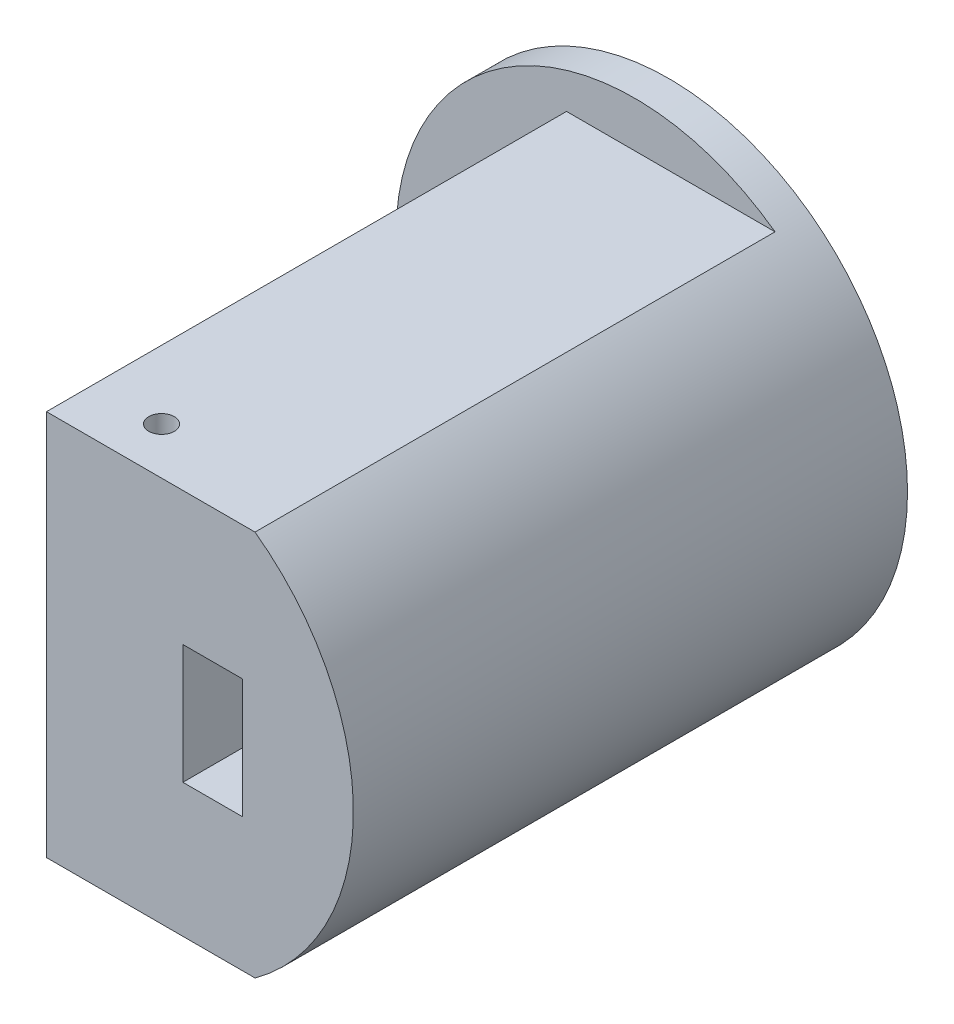
ISO-10303-21;
HEADER;
FILE_DESCRIPTION(('STEP AP214'),'2;1');
FILE_NAME('part.step','',(''),(''),'','','');
FILE_SCHEMA(('AUTOMOTIVE_DESIGN { 1 0 10303 214 1 1 1 1 }'));
ENDSEC;
DATA;
#1=APPLICATION_CONTEXT('core data for automotive mechanical design processes');
#2=APPLICATION_PROTOCOL_DEFINITION('international standard','automotive_design',2000,#1);
#3=PRODUCT_CONTEXT('',#1,'mechanical');
#4=PRODUCT('Part','Part','',(#3));
#5=PRODUCT_RELATED_PRODUCT_CATEGORY('part','',(#4));
#6=PRODUCT_DEFINITION_FORMATION('','',#4);
#7=PRODUCT_DEFINITION_CONTEXT('part definition',#1,'design');
#8=PRODUCT_DEFINITION('design','',#6,#7);
#9=PRODUCT_DEFINITION_SHAPE('','',#8);
#10=(LENGTH_UNIT() NAMED_UNIT(*) SI_UNIT(.MILLI.,.METRE.));
#11=(NAMED_UNIT(*) PLANE_ANGLE_UNIT() SI_UNIT($,.RADIAN.));
#12=(NAMED_UNIT(*) SI_UNIT($,.STERADIAN.) SOLID_ANGLE_UNIT());
#13=UNCERTAINTY_MEASURE_WITH_UNIT(LENGTH_MEASURE(1.E-05),#10,'distance_accuracy_value','');
#14=(GEOMETRIC_REPRESENTATION_CONTEXT(3) GLOBAL_UNCERTAINTY_ASSIGNED_CONTEXT((#13)) GLOBAL_UNIT_ASSIGNED_CONTEXT((#10,
#11,#12)) REPRESENTATION_CONTEXT('',''));
#15=CARTESIAN_POINT('',(0.,0.,0.));
#16=DIRECTION('',(0.,0.,1.));
#17=DIRECTION('',(1.,0.,0.));
#18=AXIS2_PLACEMENT_3D('',#15,#16,#17);
#19=CARTESIAN_POINT('',(0.,0.,32.5));
#20=DIRECTION('',(0.,0.,1.));
#21=DIRECTION('',(1.,0.,0.));
#22=AXIS2_PLACEMENT_3D('',#19,#20,#21);
#23=PLANE('',#22);
#24=DIRECTION('',(0.,-1.,0.));
#25=VECTOR('',#24,1.);
#26=CARTESIAN_POINT('',(-4.,11.3249773139559,32.5));
#27=LINE('',#26,#25);
#28=CARTESIAN_POINT('',(-4.,11.3249773139559,32.5));
#29=VERTEX_POINT('',#28);
#30=CARTESIAN_POINT('',(-4.,-11.3249773139559,32.5));
#31=VERTEX_POINT('',#30);
#32=EDGE_CURVE('E247',#29,#31,#27,.T.);
#33=ORIENTED_EDGE('',*,*,#32,.T.);
#34=DIRECTION('',(1.,0.,0.));
#35=VECTOR('',#34,1.);
#36=CARTESIAN_POINT('',(-4.,-11.3249773139559,32.5));
#37=LINE('',#36,#35);
#38=CARTESIAN_POINT('',(8.23072832976426,-11.3249773139559,32.5));
#39=VERTEX_POINT('',#38);
#40=EDGE_CURVE('E251',#31,#39,#37,.T.);
#41=ORIENTED_EDGE('',*,*,#40,.T.);
#42=CARTESIAN_POINT('',(0.,0.,32.5));
#43=DIRECTION('',(0.,0.,1.));
#44=DIRECTION('',(1.,0.,0.));
#45=AXIS2_PLACEMENT_3D('',#42,#43,#44);
#46=CIRCLE('',#45,14.);
#47=CARTESIAN_POINT('',(8.23072832976426,11.3249773139559,32.5));
#48=VERTEX_POINT('',#47);
#49=EDGE_CURVE('E195',#39,#48,#46,.T.);
#50=ORIENTED_EDGE('',*,*,#49,.T.);
#51=DIRECTION('',(-1.,0.,0.));
#52=VECTOR('',#51,1.);
#53=CARTESIAN_POINT('',(4.,11.3249773139559,32.5));
#54=LINE('',#53,#52);
#55=EDGE_CURVE('E254',#48,#29,#54,.T.);
#56=ORIENTED_EDGE('',*,*,#55,.T.);
#57=EDGE_LOOP('',(#33,#41,#50,#56));
#58=FACE_BOUND('',#57,.T.);
#59=DIRECTION('',(1.,0.,0.));
#60=VECTOR('',#59,1.);
#61=CARTESIAN_POINT('',(0.,3.5,32.5));
#62=LINE('',#61,#60);
#63=CARTESIAN_POINT('',(4.,3.5,32.5));
#64=VERTEX_POINT('',#63);
#65=CARTESIAN_POINT('',(7.5,3.5,32.5));
#66=VERTEX_POINT('',#65);
#67=EDGE_CURVE('E186',#64,#66,#62,.T.);
#68=ORIENTED_EDGE('',*,*,#67,.T.);
#69=DIRECTION('',(0.,-1.,0.));
#70=VECTOR('',#69,1.);
#71=CARTESIAN_POINT('',(7.5,0.,32.5));
#72=LINE('',#71,#70);
#73=CARTESIAN_POINT('',(7.50000000000001,-3.5,32.5));
#74=VERTEX_POINT('',#73);
#75=EDGE_CURVE('E63',#66,#74,#72,.T.);
#76=ORIENTED_EDGE('',*,*,#75,.T.);
#77=DIRECTION('',(1.,0.,0.));
#78=VECTOR('',#77,1.);
#79=CARTESIAN_POINT('',(0.,-3.5,32.5));
#80=LINE('',#79,#78);
#81=CARTESIAN_POINT('',(4.,-3.5,32.5));
#82=VERTEX_POINT('',#81);
#83=EDGE_CURVE('E173',#82,#74,#80,.T.);
#84=ORIENTED_EDGE('',*,*,#83,.F.);
#85=DIRECTION('',(0.,1.,0.));
#86=VECTOR('',#85,1.);
#87=CARTESIAN_POINT('',(4.,0.,32.5));
#88=LINE('',#87,#86);
#89=EDGE_CURVE('E177',#82,#64,#88,.T.);
#90=ORIENTED_EDGE('',*,*,#89,.T.);
#91=EDGE_LOOP('',(#68,#76,#84,#90));
#92=FACE_BOUND('',#91,.T.);
#93=ADVANCED_FACE('F47',(#58,#92),#23,.T.);
#94=CARTESIAN_POINT('',(-3.,0.,27.));
#95=DIRECTION('',(1.,0.,0.));
#96=DIRECTION('',(0.,0.,-1.));
#97=AXIS2_PLACEMENT_3D('',#94,#95,#96);
#98=PLANE('',#97);
#99=DIRECTION('',(0.,0.,-1.));
#100=VECTOR('',#99,1.);
#101=CARTESIAN_POINT('',(-3.,9.2,27.));
#102=LINE('',#101,#100);
#103=CARTESIAN_POINT('',(-3.,9.2,22.));
#104=VERTEX_POINT('',#103);
#105=CARTESIAN_POINT('',(-3.,9.2,0.));
#106=VERTEX_POINT('',#105);
#107=EDGE_CURVE('E268',#104,#106,#102,.T.);
#108=ORIENTED_EDGE('',*,*,#107,.F.);
#109=DIRECTION('',(0.,-1.,0.));
#110=VECTOR('',#109,1.);
#111=CARTESIAN_POINT('',(-3.,0.,22.));
#112=LINE('',#111,#110);
#113=CARTESIAN_POINT('',(-3.,-9.2,22.));
#114=VERTEX_POINT('',#113);
#115=EDGE_CURVE('E227',#104,#114,#112,.T.);
#116=ORIENTED_EDGE('',*,*,#115,.T.);
#117=DIRECTION('',(0.,0.,-1.));
#118=VECTOR('',#117,1.);
#119=CARTESIAN_POINT('',(-3.,-9.2,27.));
#120=LINE('',#119,#118);
#121=CARTESIAN_POINT('',(-3.,-9.2,0.));
#122=VERTEX_POINT('',#121);
#123=EDGE_CURVE('E288',#114,#122,#120,.T.);
#124=ORIENTED_EDGE('',*,*,#123,.T.);
#125=DIRECTION('',(0.,-1.,0.));
#126=VECTOR('',#125,1.);
#127=CARTESIAN_POINT('',(-3.,9.2,0.));
#128=LINE('',#127,#126);
#129=EDGE_CURVE('E243',#106,#122,#128,.T.);
#130=ORIENTED_EDGE('',*,*,#129,.F.);
#131=EDGE_LOOP('',(#108,#116,#124,#130));
#132=FACE_BOUND('',#131,.T.);
#133=ADVANCED_FACE('F325',(#132),#98,.T.);
#134=CARTESIAN_POINT('',(-4.,0.,27.));
#135=DIRECTION('',(-1.,0.,0.));
#136=DIRECTION('',(0.,-1.,0.));
#137=AXIS2_PLACEMENT_3D('',#134,#135,#136);
#138=PLANE('',#137);
#139=DIRECTION('',(0.,1.,0.));
#140=VECTOR('',#139,1.);
#141=CARTESIAN_POINT('',(-4.,0.,2.));
#142=LINE('',#141,#140);
#143=CARTESIAN_POINT('',(-4.,-11.3249773139559,2.));
#144=VERTEX_POINT('',#143);
#145=CARTESIAN_POINT('',(-4.,11.3249773139559,2.));
#146=VERTEX_POINT('',#145);
#147=EDGE_CURVE('E263',#144,#146,#142,.T.);
#148=ORIENTED_EDGE('',*,*,#147,.F.);
#149=DIRECTION('',(0.,0.,-1.));
#150=VECTOR('',#149,1.);
#151=CARTESIAN_POINT('',(-4.,-11.3249773139559,27.));
#152=LINE('',#151,#150);
#153=EDGE_CURVE('E276',#31,#144,#152,.T.);
#154=ORIENTED_EDGE('',*,*,#153,.F.);
#155=ORIENTED_EDGE('',*,*,#32,.F.);
#156=DIRECTION('',(0.,0.,-1.));
#157=VECTOR('',#156,1.);
#158=CARTESIAN_POINT('',(-4.,11.3249773139559,27.));
#159=LINE('',#158,#157);
#160=EDGE_CURVE('E280',#29,#146,#159,.T.);
#161=ORIENTED_EDGE('',*,*,#160,.T.);
#162=EDGE_LOOP('',(#148,#154,#155,#161));
#163=FACE_BOUND('',#162,.T.);
#164=DIRECTION('',(0.,1.,0.));
#165=VECTOR('',#164,1.);
#166=CARTESIAN_POINT('',(-4.,0.,22.));
#167=LINE('',#166,#165);
#168=CARTESIAN_POINT('',(-4.,-9.2,22.));
#169=VERTEX_POINT('',#168);
#170=CARTESIAN_POINT('',(-4.,9.2,22.));
#171=VERTEX_POINT('',#170);
#172=EDGE_CURVE('E56',#169,#171,#167,.T.);
#173=ORIENTED_EDGE('',*,*,#172,.T.);
#174=DIRECTION('',(0.,0.,1.));
#175=VECTOR('',#174,1.);
#176=CARTESIAN_POINT('',(-4.,9.2,27.));
#177=LINE('',#176,#175);
#178=CARTESIAN_POINT('',(-4.,9.2,27.));
#179=VERTEX_POINT('',#178);
#180=EDGE_CURVE('E11',#171,#179,#177,.T.);
#181=ORIENTED_EDGE('',*,*,#180,.T.);
#182=DIRECTION('',(0.,-1.,0.));
#183=VECTOR('',#182,1.);
#184=CARTESIAN_POINT('',(-4.,0.,27.));
#185=LINE('',#184,#183);
#186=CARTESIAN_POINT('',(-4.,-9.2,27.));
#187=VERTEX_POINT('',#186);
#188=EDGE_CURVE('E300',#179,#187,#185,.T.);
#189=ORIENTED_EDGE('',*,*,#188,.T.);
#190=DIRECTION('',(0.,0.,-1.));
#191=VECTOR('',#190,1.);
#192=CARTESIAN_POINT('',(-4.,-9.2,27.));
#193=LINE('',#192,#191);
#194=EDGE_CURVE('E307',#187,#169,#193,.T.);
#195=ORIENTED_EDGE('',*,*,#194,.T.);
#196=EDGE_LOOP('',(#173,#181,#189,#195));
#197=FACE_BOUND('',#196,.T.);
#198=ADVANCED_FACE('F313',(#163,#197),#138,.T.);
#199=CARTESIAN_POINT('',(0.,-9.2,27.));
#200=DIRECTION('',(0.,1.,0.));
#201=DIRECTION('',(0.,0.,1.));
#202=AXIS2_PLACEMENT_3D('',#199,#200,#201);
#203=PLANE('',#202);
#204=DIRECTION('',(0.,0.,-1.));
#205=VECTOR('',#204,1.);
#206=CARTESIAN_POINT('',(3.,-9.2,27.));
#207=LINE('',#206,#205);
#208=CARTESIAN_POINT('',(3.,-9.2,27.));
#209=VERTEX_POINT('',#208);
#210=CARTESIAN_POINT('',(3.,-9.2,0.));
#211=VERTEX_POINT('',#210);
#212=EDGE_CURVE('E291',#209,#211,#207,.T.);
#213=ORIENTED_EDGE('',*,*,#212,.T.);
#214=DIRECTION('',(1.,0.,0.));
#215=VECTOR('',#214,1.);
#216=CARTESIAN_POINT('',(-3.,-9.2,0.));
#217=LINE('',#216,#215);
#218=EDGE_CURVE('E231',#122,#211,#217,.T.);
#219=ORIENTED_EDGE('',*,*,#218,.F.);
#220=ORIENTED_EDGE('',*,*,#123,.F.);
#221=DIRECTION('',(1.,0.,0.));
#222=VECTOR('',#221,1.);
#223=CARTESIAN_POINT('',(-14.,-9.2,22.));
#224=LINE('',#223,#222);
#225=EDGE_CURVE('E220',#169,#114,#224,.T.);
#226=ORIENTED_EDGE('',*,*,#225,.F.);
#227=ORIENTED_EDGE('',*,*,#194,.F.);
#228=DIRECTION('',(1.,0.,0.));
#229=VECTOR('',#228,1.);
#230=CARTESIAN_POINT('',(0.,-9.2,27.));
#231=LINE('',#230,#229);
#232=EDGE_CURVE('E71',#187,#209,#231,.T.);
#233=ORIENTED_EDGE('',*,*,#232,.T.);
#234=EDGE_LOOP('',(#213,#219,#220,#226,#227,#233));
#235=FACE_BOUND('',#234,.T.);
#236=ADVANCED_FACE('F320',(#235),#203,.T.);
#237=CARTESIAN_POINT('',(3.,0.,27.));
#238=DIRECTION('',(1.,0.,0.));
#239=DIRECTION('',(0.,0.,-1.));
#240=AXIS2_PLACEMENT_3D('',#237,#238,#239);
#241=PLANE('',#240);
#242=DIRECTION('',(0.,0.,-1.));
#243=VECTOR('',#242,1.);
#244=CARTESIAN_POINT('',(3.,9.2,27.));
#245=LINE('',#244,#243);
#246=CARTESIAN_POINT('',(3.,9.2,27.));
#247=VERTEX_POINT('',#246);
#248=CARTESIAN_POINT('',(3.,9.2,0.));
#249=VERTEX_POINT('',#248);
#250=EDGE_CURVE('E281',#247,#249,#245,.T.);
#251=ORIENTED_EDGE('',*,*,#250,.T.);
#252=DIRECTION('',(0.,1.,0.));
#253=VECTOR('',#252,1.);
#254=CARTESIAN_POINT('',(3.,-9.2,0.));
#255=LINE('',#254,#253);
#256=EDGE_CURVE('E235',#211,#249,#255,.T.);
#257=ORIENTED_EDGE('',*,*,#256,.F.);
#258=ORIENTED_EDGE('',*,*,#212,.F.);
#259=DIRECTION('',(0.,-1.,0.));
#260=VECTOR('',#259,1.);
#261=CARTESIAN_POINT('',(3.,0.,27.));
#262=LINE('',#261,#260);
#263=EDGE_CURVE('E262',#247,#209,#262,.T.);
#264=ORIENTED_EDGE('',*,*,#263,.F.);
#265=EDGE_LOOP('',(#251,#257,#258,#264));
#266=FACE_BOUND('',#265,.T.);
#267=ADVANCED_FACE('F342',(#266),#241,.F.);
#268=CARTESIAN_POINT('',(0.,9.2,27.));
#269=DIRECTION('',(0.,1.,0.));
#270=DIRECTION('',(0.,0.,1.));
#271=AXIS2_PLACEMENT_3D('',#268,#269,#270);
#272=PLANE('',#271);
#273=DIRECTION('',(1.,0.,0.));
#274=VECTOR('',#273,1.);
#275=CARTESIAN_POINT('',(0.,9.2,27.));
#276=LINE('',#275,#274);
#277=EDGE_CURVE('E259',#179,#247,#276,.T.);
#278=ORIENTED_EDGE('',*,*,#277,.F.);
#279=ORIENTED_EDGE('',*,*,#180,.F.);
#280=DIRECTION('',(1.,0.,0.));
#281=VECTOR('',#280,1.);
#282=CARTESIAN_POINT('',(-14.,9.2,22.));
#283=LINE('',#282,#281);
#284=EDGE_CURVE('E223',#171,#104,#283,.T.);
#285=ORIENTED_EDGE('',*,*,#284,.T.);
#286=ORIENTED_EDGE('',*,*,#107,.T.);
#287=DIRECTION('',(-1.,0.,0.));
#288=VECTOR('',#287,1.);
#289=CARTESIAN_POINT('',(3.,9.2,0.));
#290=LINE('',#289,#288);
#291=EDGE_CURVE('E239',#249,#106,#290,.T.);
#292=ORIENTED_EDGE('',*,*,#291,.F.);
#293=ORIENTED_EDGE('',*,*,#250,.F.);
#294=EDGE_LOOP('',(#278,#279,#285,#286,#292,#293));
#295=FACE_BOUND('',#294,.T.);
#296=ADVANCED_FACE('F327',(#295),#272,.F.);
#297=CARTESIAN_POINT('',(0.,0.,27.));
#298=DIRECTION('',(0.,0.,1.));
#299=DIRECTION('',(1.,0.,0.));
#300=AXIS2_PLACEMENT_3D('',#297,#298,#299);
#301=PLANE('',#300);
#302=ORIENTED_EDGE('',*,*,#232,.F.);
#303=ORIENTED_EDGE('',*,*,#188,.F.);
#304=ORIENTED_EDGE('',*,*,#277,.T.);
#305=ORIENTED_EDGE('',*,*,#263,.T.);
#306=EDGE_LOOP('',(#302,#303,#304,#305));
#307=FACE_BOUND('',#306,.T.);
#308=ADVANCED_FACE('F331',(#307),#301,.F.);
#309=CARTESIAN_POINT('',(0.,0.,2.));
#310=DIRECTION('',(0.,0.,1.));
#311=DIRECTION('',(1.,0.,0.));
#312=AXIS2_PLACEMENT_3D('',#309,#310,#311);
#313=PLANE('',#312);
#314=DIRECTION('',(1.,0.,0.));
#315=VECTOR('',#314,1.);
#316=CARTESIAN_POINT('',(0.,11.3249773139559,2.));
#317=LINE('',#316,#315);
#318=CARTESIAN_POINT('',(8.23072832976426,11.3249773139559,2.));
#319=VERTEX_POINT('',#318);
#320=EDGE_CURVE('E271',#146,#319,#317,.T.);
#321=ORIENTED_EDGE('',*,*,#320,.T.);
#322=CARTESIAN_POINT('',(0.,0.,2.));
#323=DIRECTION('',(0.,0.,1.));
#324=DIRECTION('',(1.,0.,0.));
#325=AXIS2_PLACEMENT_3D('',#322,#323,#324);
#326=CIRCLE('',#325,14.);
#327=CARTESIAN_POINT('',(8.23072832976426,-11.3249773139559,2.));
#328=VERTEX_POINT('',#327);
#329=EDGE_CURVE('E296',#319,#328,#326,.T.);
#330=ORIENTED_EDGE('',*,*,#329,.T.);
#331=DIRECTION('',(1.,0.,0.));
#332=VECTOR('',#331,1.);
#333=CARTESIAN_POINT('',(0.,-11.3249773139559,2.));
#334=LINE('',#333,#332);
#335=EDGE_CURVE('E258',#144,#328,#334,.T.);
#336=ORIENTED_EDGE('',*,*,#335,.F.);
#337=ORIENTED_EDGE('',*,*,#147,.T.);
#338=EDGE_LOOP('',(#321,#330,#336,#337));
#339=FACE_BOUND('',#338,.T.);
#340=ADVANCED_FACE('F333',(#339),#313,.T.);
#341=CARTESIAN_POINT('',(0.,0.,2.));
#342=DIRECTION('',(0.,0.,-1.));
#343=DIRECTION('',(-1.,0.,0.));
#344=AXIS2_PLACEMENT_3D('',#341,#342,#343);
#345=CYLINDRICAL_SURFACE('',#344,14.);
#346=ORIENTED_EDGE('',*,*,#329,.F.);
#347=DIRECTION('',(0.,0.,-1.));
#348=VECTOR('',#347,1.);
#349=CARTESIAN_POINT('',(8.23072832976426,11.3249773139559,57.259249678584));
#350=LINE('',#349,#348);
#351=EDGE_CURVE('E204',#48,#319,#350,.T.);
#352=ORIENTED_EDGE('',*,*,#351,.F.);
#353=ORIENTED_EDGE('',*,*,#49,.F.);
#354=DIRECTION('',(0.,0.,-1.));
#355=VECTOR('',#354,1.);
#356=CARTESIAN_POINT('',(8.23072832976426,-11.3249773139559,57.259249678584));
#357=LINE('',#356,#355);
#358=EDGE_CURVE('E205',#39,#328,#357,.T.);
#359=ORIENTED_EDGE('',*,*,#358,.T.);
#360=EDGE_LOOP('',(#346,#352,#353,#359));
#361=FACE_BOUND('',#360,.T.);
#362=CARTESIAN_POINT('',(0.,0.,0.));
#363=DIRECTION('',(0.,0.,1.));
#364=DIRECTION('',(1.,0.,0.));
#365=AXIS2_PLACEMENT_3D('',#362,#363,#364);
#366=CIRCLE('',#365,14.);
#367=CARTESIAN_POINT('',(14.,0.,0.));
#368=VERTEX_POINT('',#367);
#369=EDGE_CURVE('E285',#368,#368,#366,.T.);
#370=ORIENTED_EDGE('',*,*,#369,.T.);
#371=EDGE_LOOP('',(#370));
#372=FACE_BOUND('',#371,.T.);
#373=ADVANCED_FACE('F49',(#361,#372),#345,.T.);
#374=CARTESIAN_POINT('',(0.,0.,0.));
#375=DIRECTION('',(0.,0.,1.));
#376=DIRECTION('',(1.,0.,0.));
#377=AXIS2_PLACEMENT_3D('',#374,#375,#376);
#378=PLANE('',#377);
#379=ORIENTED_EDGE('',*,*,#129,.T.);
#380=ORIENTED_EDGE('',*,*,#218,.T.);
#381=ORIENTED_EDGE('',*,*,#256,.T.);
#382=ORIENTED_EDGE('',*,*,#291,.T.);
#383=EDGE_LOOP('',(#379,#380,#381,#382));
#384=FACE_BOUND('',#383,.T.);
#385=ORIENTED_EDGE('',*,*,#369,.F.);
#386=EDGE_LOOP('',(#385));
#387=FACE_BOUND('',#386,.T.);
#388=ADVANCED_FACE('F406',(#384,#387),#378,.F.);
#389=CARTESIAN_POINT('',(0.,-11.3249773139559,27.));
#390=DIRECTION('',(0.,1.,0.));
#391=DIRECTION('',(-1.,0.,0.));
#392=AXIS2_PLACEMENT_3D('',#389,#390,#391);
#393=PLANE('',#392);
#394=CARTESIAN_POINT('',(0.,-11.3249773139559,29.75));
#395=DIRECTION('',(0.,1.,0.));
#396=DIRECTION('',(-1.,0.,0.));
#397=AXIS2_PLACEMENT_3D('',#394,#395,#396);
#398=CIRCLE('',#397,0.75);
#399=CARTESIAN_POINT('',(-0.749999999999998,-11.3249773139559,29.75));
#400=VERTEX_POINT('',#399);
#401=EDGE_CURVE('E216',#400,#400,#398,.T.);
#402=ORIENTED_EDGE('',*,*,#401,.T.);
#403=EDGE_LOOP('',(#402));
#404=FACE_BOUND('',#403,.T.);
#405=ORIENTED_EDGE('',*,*,#335,.T.);
#406=ORIENTED_EDGE('',*,*,#358,.F.);
#407=ORIENTED_EDGE('',*,*,#40,.F.);
#408=ORIENTED_EDGE('',*,*,#153,.T.);
#409=EDGE_LOOP('',(#405,#406,#407,#408));
#410=FACE_BOUND('',#409,.T.);
#411=ADVANCED_FACE('F399',(#404,#410),#393,.F.);
#412=CARTESIAN_POINT('',(0.,11.3249773139559,27.));
#413=DIRECTION('',(0.,1.,0.));
#414=DIRECTION('',(-1.,0.,0.));
#415=AXIS2_PLACEMENT_3D('',#412,#413,#414);
#416=PLANE('',#415);
#417=CARTESIAN_POINT('',(0.,11.3249773139559,29.75));
#418=DIRECTION('',(0.,1.,0.));
#419=DIRECTION('',(-1.,0.,0.));
#420=AXIS2_PLACEMENT_3D('',#417,#418,#419);
#421=CIRCLE('',#420,0.75);
#422=CARTESIAN_POINT('',(-0.750000000000003,11.3249773139559,29.75));
#423=VERTEX_POINT('',#422);
#424=EDGE_CURVE('E209',#423,#423,#421,.T.);
#425=ORIENTED_EDGE('',*,*,#424,.F.);
#426=EDGE_LOOP('',(#425));
#427=FACE_BOUND('',#426,.T.);
#428=ORIENTED_EDGE('',*,*,#320,.F.);
#429=ORIENTED_EDGE('',*,*,#160,.F.);
#430=ORIENTED_EDGE('',*,*,#55,.F.);
#431=ORIENTED_EDGE('',*,*,#351,.T.);
#432=EDGE_LOOP('',(#428,#429,#430,#431));
#433=FACE_BOUND('',#432,.T.);
#434=ADVANCED_FACE('F359',(#427,#433),#416,.T.);
#435=CARTESIAN_POINT('',(-14.,0.,22.));
#436=DIRECTION('',(0.,0.,1.));
#437=DIRECTION('',(0.,-1.,0.));
#438=AXIS2_PLACEMENT_3D('',#435,#436,#437);
#439=PLANE('',#438);
#440=ORIENTED_EDGE('',*,*,#284,.F.);
#441=ORIENTED_EDGE('',*,*,#172,.F.);
#442=ORIENTED_EDGE('',*,*,#225,.T.);
#443=ORIENTED_EDGE('',*,*,#115,.F.);
#444=EDGE_LOOP('',(#440,#441,#442,#443));
#445=FACE_BOUND('',#444,.T.);
#446=ADVANCED_FACE('F317',(#445),#439,.T.);
#447=CARTESIAN_POINT('',(0.,-14.,29.75));
#448=DIRECTION('',(0.,1.,0.));
#449=DIRECTION('',(-1.,0.,0.));
#450=AXIS2_PLACEMENT_3D('',#447,#448,#449);
#451=CYLINDRICAL_SURFACE('',#450,0.75);
#452=ORIENTED_EDGE('',*,*,#424,.T.);
#453=EDGE_LOOP('',(#452));
#454=FACE_BOUND('',#453,.T.);
#455=ORIENTED_EDGE('',*,*,#401,.F.);
#456=EDGE_LOOP('',(#455));
#457=FACE_BOUND('',#456,.T.);
#458=ADVANCED_FACE('F358',(#454,#457),#451,.F.);
#459=CARTESIAN_POINT('',(7.5,0.,26.5));
#460=DIRECTION('',(-1.,0.,0.));
#461=DIRECTION('',(0.,-1.,0.));
#462=AXIS2_PLACEMENT_3D('',#459,#460,#461);
#463=PLANE('',#462);
#464=ORIENTED_EDGE('',*,*,#75,.F.);
#465=DIRECTION('',(0.,0.,1.));
#466=VECTOR('',#465,1.);
#467=CARTESIAN_POINT('',(7.5,3.5,26.5));
#468=LINE('',#467,#466);
#469=CARTESIAN_POINT('',(7.5,3.5,26.5));
#470=VERTEX_POINT('',#469);
#471=EDGE_CURVE('E154',#470,#66,#468,.T.);
#472=ORIENTED_EDGE('',*,*,#471,.F.);
#473=DIRECTION('',(0.,-1.,0.));
#474=VECTOR('',#473,1.);
#475=CARTESIAN_POINT('',(7.5,0.,26.5));
#476=LINE('',#475,#474);
#477=CARTESIAN_POINT('',(7.50000000000001,-3.5,26.5));
#478=VERTEX_POINT('',#477);
#479=EDGE_CURVE('E162',#470,#478,#476,.T.);
#480=ORIENTED_EDGE('',*,*,#479,.T.);
#481=DIRECTION('',(0.,0.,1.));
#482=VECTOR('',#481,1.);
#483=CARTESIAN_POINT('',(7.50000000000001,-3.5,26.5));
#484=LINE('',#483,#482);
#485=EDGE_CURVE('E192',#478,#74,#484,.T.);
#486=ORIENTED_EDGE('',*,*,#485,.T.);
#487=EDGE_LOOP('',(#464,#472,#480,#486));
#488=FACE_BOUND('',#487,.T.);
#489=ADVANCED_FACE('F164',(#488),#463,.T.);
#490=CARTESIAN_POINT('',(0.,-3.5,26.5));
#491=DIRECTION('',(0.,-1.,0.));
#492=DIRECTION('',(1.,0.,0.));
#493=AXIS2_PLACEMENT_3D('',#490,#491,#492);
#494=PLANE('',#493);
#495=ORIENTED_EDGE('',*,*,#83,.T.);
#496=ORIENTED_EDGE('',*,*,#485,.F.);
#497=DIRECTION('',(1.,0.,0.));
#498=VECTOR('',#497,1.);
#499=CARTESIAN_POINT('',(0.,-3.5,26.5));
#500=LINE('',#499,#498);
#501=CARTESIAN_POINT('',(4.,-3.5,26.5));
#502=VERTEX_POINT('',#501);
#503=EDGE_CURVE('E167',#502,#478,#500,.T.);
#504=ORIENTED_EDGE('',*,*,#503,.F.);
#505=DIRECTION('',(0.,0.,1.));
#506=VECTOR('',#505,1.);
#507=CARTESIAN_POINT('',(4.,-3.5,26.5));
#508=LINE('',#507,#506);
#509=EDGE_CURVE('E196',#502,#82,#508,.T.);
#510=ORIENTED_EDGE('',*,*,#509,.T.);
#511=EDGE_LOOP('',(#495,#496,#504,#510));
#512=FACE_BOUND('',#511,.T.);
#513=ADVANCED_FACE('F364',(#512),#494,.F.);
#514=CARTESIAN_POINT('',(4.,0.,26.5));
#515=DIRECTION('',(1.,0.,0.));
#516=DIRECTION('',(0.,0.,-1.));
#517=AXIS2_PLACEMENT_3D('',#514,#515,#516);
#518=PLANE('',#517);
#519=ORIENTED_EDGE('',*,*,#89,.F.);
#520=ORIENTED_EDGE('',*,*,#509,.F.);
#521=DIRECTION('',(0.,1.,0.));
#522=VECTOR('',#521,1.);
#523=CARTESIAN_POINT('',(4.,0.,26.5));
#524=LINE('',#523,#522);
#525=CARTESIAN_POINT('',(4.,3.5,26.5));
#526=VERTEX_POINT('',#525);
#527=EDGE_CURVE('E161',#502,#526,#524,.T.);
#528=ORIENTED_EDGE('',*,*,#527,.T.);
#529=DIRECTION('',(0.,0.,1.));
#530=VECTOR('',#529,1.);
#531=CARTESIAN_POINT('',(4.,3.5,26.5));
#532=LINE('',#531,#530);
#533=EDGE_CURVE('E156',#526,#64,#532,.T.);
#534=ORIENTED_EDGE('',*,*,#533,.T.);
#535=EDGE_LOOP('',(#519,#520,#528,#534));
#536=FACE_BOUND('',#535,.T.);
#537=ADVANCED_FACE('F367',(#536),#518,.T.);
#538=CARTESIAN_POINT('',(0.,3.5,26.5));
#539=DIRECTION('',(0.,-1.,0.));
#540=DIRECTION('',(1.,0.,0.));
#541=AXIS2_PLACEMENT_3D('',#538,#539,#540);
#542=PLANE('',#541);
#543=ORIENTED_EDGE('',*,*,#67,.F.);
#544=ORIENTED_EDGE('',*,*,#533,.F.);
#545=DIRECTION('',(1.,0.,0.));
#546=VECTOR('',#545,1.);
#547=CARTESIAN_POINT('',(0.,3.5,26.5));
#548=LINE('',#547,#546);
#549=EDGE_CURVE('E151',#526,#470,#548,.T.);
#550=ORIENTED_EDGE('',*,*,#549,.T.);
#551=ORIENTED_EDGE('',*,*,#471,.T.);
#552=EDGE_LOOP('',(#543,#544,#550,#551));
#553=FACE_BOUND('',#552,.T.);
#554=ADVANCED_FACE('F153',(#553),#542,.T.);
#555=CARTESIAN_POINT('',(0.,0.,26.5));
#556=DIRECTION('',(0.,0.,1.));
#557=DIRECTION('',(1.,0.,0.));
#558=AXIS2_PLACEMENT_3D('',#555,#556,#557);
#559=PLANE('',#558);
#560=ORIENTED_EDGE('',*,*,#479,.F.);
#561=ORIENTED_EDGE('',*,*,#549,.F.);
#562=ORIENTED_EDGE('',*,*,#527,.F.);
#563=ORIENTED_EDGE('',*,*,#503,.T.);
#564=EDGE_LOOP('',(#560,#561,#562,#563));
#565=FACE_BOUND('',#564,.T.);
#566=ADVANCED_FACE('F170',(#565),#559,.T.);
#567=CLOSED_SHELL('',(#93,#133,#198,#236,#267,#296,#308,#340,#373,#388,#411,#434,#446,#458,#489,
#513,#537,#554,#566));
#568=MANIFOLD_SOLID_BREP('B2',#567);
#569=ADVANCED_BREP_SHAPE_REPRESENTATION('',(#18,#568),#14);
#570=SHAPE_DEFINITION_REPRESENTATION(#9,#569);
ENDSEC;
END-ISO-10303-21;
